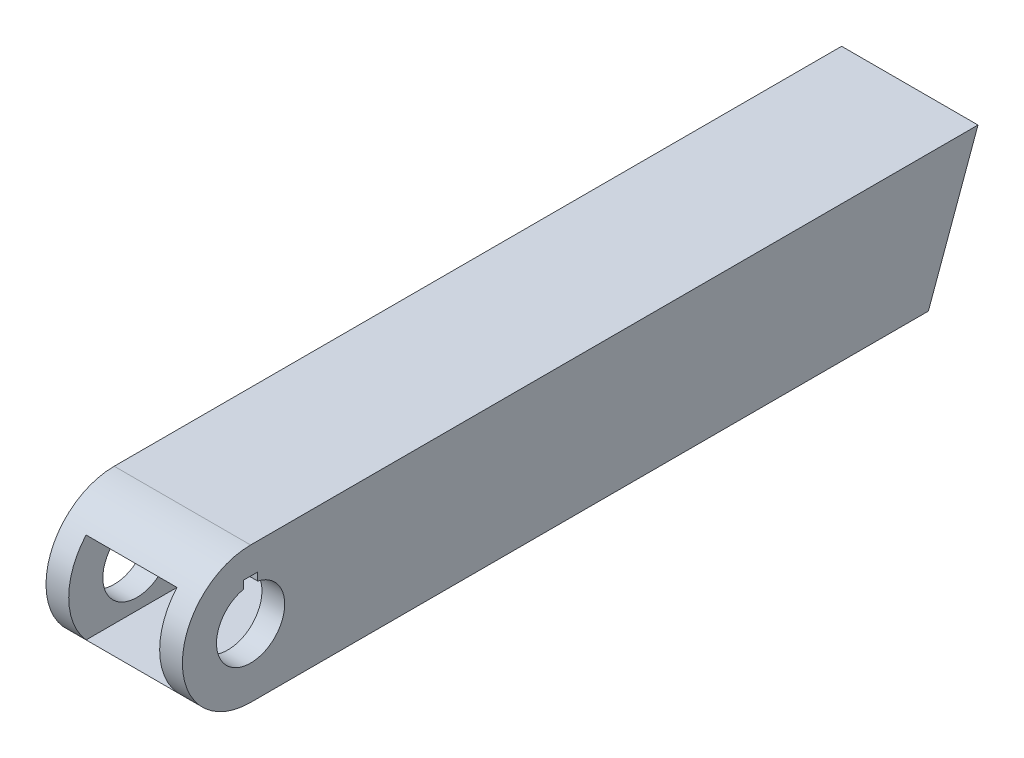
ISO-10303-21;
HEADER;
FILE_DESCRIPTION(('STEP AP214'),'2;1');
FILE_NAME('part.step','',(''),(''),'','','');
FILE_SCHEMA(('AUTOMOTIVE_DESIGN { 1 0 10303 214 1 1 1 1 }'));
ENDSEC;
DATA;
#1=APPLICATION_CONTEXT('core data for automotive mechanical design processes');
#2=APPLICATION_PROTOCOL_DEFINITION('international standard','automotive_design',2000,#1);
#3=PRODUCT_CONTEXT('',#1,'mechanical');
#4=PRODUCT('Part','Part','',(#3));
#5=PRODUCT_RELATED_PRODUCT_CATEGORY('part','',(#4));
#6=PRODUCT_DEFINITION_FORMATION('','',#4);
#7=PRODUCT_DEFINITION_CONTEXT('part definition',#1,'design');
#8=PRODUCT_DEFINITION('design','',#6,#7);
#9=PRODUCT_DEFINITION_SHAPE('','',#8);
#10=(LENGTH_UNIT() NAMED_UNIT(*) SI_UNIT(.MILLI.,.METRE.));
#11=(NAMED_UNIT(*) PLANE_ANGLE_UNIT() SI_UNIT($,.RADIAN.));
#12=(NAMED_UNIT(*) SI_UNIT($,.STERADIAN.) SOLID_ANGLE_UNIT());
#13=UNCERTAINTY_MEASURE_WITH_UNIT(LENGTH_MEASURE(1.E-05),#10,'distance_accuracy_value','');
#14=(GEOMETRIC_REPRESENTATION_CONTEXT(3) GLOBAL_UNCERTAINTY_ASSIGNED_CONTEXT((#13)) GLOBAL_UNIT_ASSIGNED_CONTEXT((#10,
#11,#12)) REPRESENTATION_CONTEXT('',''));
#15=CARTESIAN_POINT('',(0.,0.,0.));
#16=DIRECTION('',(0.,0.,1.));
#17=DIRECTION('',(1.,0.,0.));
#18=AXIS2_PLACEMENT_3D('',#15,#16,#17);
#19=CARTESIAN_POINT('',(19.05,0.,0.));
#20=DIRECTION('',(1.,0.,0.));
#21=DIRECTION('',(0.,0.,-1.));
#22=AXIS2_PLACEMENT_3D('',#19,#20,#21);
#23=PLANE('',#22);
#24=CARTESIAN_POINT('',(19.05,12.7,12.7));
#25=DIRECTION('',(1.,0.,0.));
#26=DIRECTION('',(0.,0.,-1.));
#27=AXIS2_PLACEMENT_3D('',#24,#25,#26);
#28=CIRCLE('',#27,4.7625);
#29=CARTESIAN_POINT('',(19.05,17.3563296973045,13.7));
#30=VERTEX_POINT('',#29);
#31=CARTESIAN_POINT('',(19.05,17.3563296973045,11.7));
#32=VERTEX_POINT('',#31);
#33=EDGE_CURVE('E295',#30,#32,#28,.T.);
#34=ORIENTED_EDGE('',*,*,#33,.F.);
#35=DIRECTION('',(0.,1.,0.));
#36=VECTOR('',#35,1.);
#37=CARTESIAN_POINT('',(19.05,0.,13.7));
#38=LINE('',#37,#36);
#39=CARTESIAN_POINT('',(19.05,18.4625,13.7));
#40=VERTEX_POINT('',#39);
#41=EDGE_CURVE('E237',#30,#40,#38,.T.);
#42=ORIENTED_EDGE('',*,*,#41,.T.);
#43=DIRECTION('',(0.,0.,1.));
#44=VECTOR('',#43,1.);
#45=CARTESIAN_POINT('',(19.05,18.4625,0.));
#46=LINE('',#45,#44);
#47=CARTESIAN_POINT('',(19.05,18.4625,11.7));
#48=VERTEX_POINT('',#47);
#49=EDGE_CURVE('E310',#48,#40,#46,.T.);
#50=ORIENTED_EDGE('',*,*,#49,.F.);
#51=DIRECTION('',(0.,1.,0.));
#52=VECTOR('',#51,1.);
#53=CARTESIAN_POINT('',(19.05,0.,11.7));
#54=LINE('',#53,#52);
#55=EDGE_CURVE('E308',#32,#48,#54,.T.);
#56=ORIENTED_EDGE('',*,*,#55,.F.);
#57=EDGE_LOOP('',(#34,#42,#50,#56));
#58=FACE_BOUND('',#57,.T.);
#59=CARTESIAN_POINT('',(19.05,12.7,12.7));
#60=DIRECTION('',(1.,0.,0.));
#61=DIRECTION('',(0.,0.,-1.));
#62=AXIS2_PLACEMENT_3D('',#59,#60,#61);
#63=CIRCLE('',#62,9.525);
#64=CARTESIAN_POINT('',(19.05,3.175,12.7));
#65=VERTEX_POINT('',#64);
#66=CARTESIAN_POINT('',(19.05,22.225,12.7));
#67=VERTEX_POINT('',#66);
#68=EDGE_CURVE('E176',#65,#67,#63,.F.);
#69=ORIENTED_EDGE('',*,*,#68,.F.);
#70=DIRECTION('',(0.,0.,-1.));
#71=VECTOR('',#70,1.);
#72=CARTESIAN_POINT('',(19.05,3.175,0.));
#73=LINE('',#72,#71);
#74=CARTESIAN_POINT('',(19.05,3.175,-81.9663670372294));
#75=VERTEX_POINT('',#74);
#76=EDGE_CURVE('E184',#65,#75,#73,.T.);
#77=ORIENTED_EDGE('',*,*,#76,.T.);
#78=DIRECTION('',(0.,-0.939692620785918,0.342020143325644));
#79=VECTOR('',#78,1.);
#80=CARTESIAN_POINT('',(19.05,-25.9720781247249,-71.3576981839989));
#81=LINE('',#80,#79);
#82=CARTESIAN_POINT('',(19.05,22.225,-88.9));
#83=VERTEX_POINT('',#82);
#84=EDGE_CURVE('E202',#83,#75,#81,.T.);
#85=ORIENTED_EDGE('',*,*,#84,.F.);
#86=DIRECTION('',(0.,0.,-1.));
#87=VECTOR('',#86,1.);
#88=CARTESIAN_POINT('',(19.05,22.225,0.));
#89=LINE('',#88,#87);
#90=EDGE_CURVE('E192',#67,#83,#89,.T.);
#91=ORIENTED_EDGE('',*,*,#90,.F.);
#92=EDGE_LOOP('',(#69,#77,#85,#91));
#93=FACE_BOUND('',#92,.T.);
#94=ADVANCED_FACE('F59',(#58,#93),#23,.T.);
#95=CARTESIAN_POINT('',(0.,0.,0.));
#96=DIRECTION('',(1.,0.,0.));
#97=DIRECTION('',(0.,0.,-1.));
#98=AXIS2_PLACEMENT_3D('',#95,#96,#97);
#99=PLANE('',#98);
#100=DIRECTION('',(0.,1.,0.));
#101=VECTOR('',#100,1.);
#102=CARTESIAN_POINT('',(0.,0.,13.7));
#103=LINE('',#102,#101);
#104=CARTESIAN_POINT('',(0.,17.3563296973045,13.7));
#105=VERTEX_POINT('',#104);
#106=CARTESIAN_POINT('',(0.,18.4625,13.7));
#107=VERTEX_POINT('',#106);
#108=EDGE_CURVE('E305',#105,#107,#103,.T.);
#109=ORIENTED_EDGE('',*,*,#108,.F.);
#110=CARTESIAN_POINT('',(0.,12.7,12.7));
#111=DIRECTION('',(1.,0.,0.));
#112=DIRECTION('',(0.,0.,-1.));
#113=AXIS2_PLACEMENT_3D('',#110,#111,#112);
#114=CIRCLE('',#113,4.7625);
#115=CARTESIAN_POINT('',(0.,17.3563296973045,11.7));
#116=VERTEX_POINT('',#115);
#117=EDGE_CURVE('E296',#105,#116,#114,.T.);
#118=ORIENTED_EDGE('',*,*,#117,.T.);
#119=DIRECTION('',(0.,1.,0.));
#120=VECTOR('',#119,1.);
#121=CARTESIAN_POINT('',(0.,0.,11.7));
#122=LINE('',#121,#120);
#123=CARTESIAN_POINT('',(0.,18.4625,11.7));
#124=VERTEX_POINT('',#123);
#125=EDGE_CURVE('E299',#116,#124,#122,.T.);
#126=ORIENTED_EDGE('',*,*,#125,.T.);
#127=DIRECTION('',(0.,0.,1.));
#128=VECTOR('',#127,1.);
#129=CARTESIAN_POINT('',(0.,18.4625,0.));
#130=LINE('',#129,#128);
#131=EDGE_CURVE('E302',#124,#107,#130,.T.);
#132=ORIENTED_EDGE('',*,*,#131,.T.);
#133=EDGE_LOOP('',(#109,#118,#126,#132));
#134=FACE_BOUND('',#133,.T.);
#135=DIRECTION('',(0.,0.,-1.));
#136=VECTOR('',#135,1.);
#137=CARTESIAN_POINT('',(0.,3.175,0.));
#138=LINE('',#137,#136);
#139=CARTESIAN_POINT('',(0.,3.175,12.7));
#140=VERTEX_POINT('',#139);
#141=CARTESIAN_POINT('',(0.,3.175,-81.9663670372294));
#142=VERTEX_POINT('',#141);
#143=EDGE_CURVE('E182',#140,#142,#138,.T.);
#144=ORIENTED_EDGE('',*,*,#143,.F.);
#145=CARTESIAN_POINT('',(0.,12.7,12.7));
#146=DIRECTION('',(1.,0.,0.));
#147=DIRECTION('',(0.,0.,-1.));
#148=AXIS2_PLACEMENT_3D('',#145,#146,#147);
#149=CIRCLE('',#148,9.525);
#150=CARTESIAN_POINT('',(0.,22.225,12.7));
#151=VERTEX_POINT('',#150);
#152=EDGE_CURVE('E168',#140,#151,#149,.F.);
#153=ORIENTED_EDGE('',*,*,#152,.T.);
#154=DIRECTION('',(0.,0.,-1.));
#155=VECTOR('',#154,1.);
#156=CARTESIAN_POINT('',(0.,22.225,0.));
#157=LINE('',#156,#155);
#158=CARTESIAN_POINT('',(0.,22.225,-88.9));
#159=VERTEX_POINT('',#158);
#160=EDGE_CURVE('E190',#151,#159,#157,.T.);
#161=ORIENTED_EDGE('',*,*,#160,.T.);
#162=DIRECTION('',(0.,-0.939692620785918,0.342020143325644));
#163=VECTOR('',#162,1.);
#164=CARTESIAN_POINT('',(0.,-25.9720781247249,-71.3576981839989));
#165=LINE('',#164,#163);
#166=EDGE_CURVE('E189',#159,#142,#165,.T.);
#167=ORIENTED_EDGE('',*,*,#166,.T.);
#168=EDGE_LOOP('',(#144,#153,#161,#167));
#169=FACE_BOUND('',#168,.T.);
#170=ADVANCED_FACE('F187',(#134,#169),#99,.F.);
#171=CARTESIAN_POINT('',(3.175,6.35,-88.9));
#172=DIRECTION('',(-1.,0.,0.));
#173=DIRECTION('',(0.,0.,1.));
#174=AXIS2_PLACEMENT_3D('',#171,#172,#173);
#175=PLANE('',#174);
#176=DIRECTION('',(0.,-1.,0.));
#177=VECTOR('',#176,1.);
#178=CARTESIAN_POINT('',(3.175,6.35,11.7));
#179=LINE('',#178,#177);
#180=CARTESIAN_POINT('',(3.175,18.4625,11.7));
#181=VERTEX_POINT('',#180);
#182=CARTESIAN_POINT('',(3.175,17.3563296973045,11.7));
#183=VERTEX_POINT('',#182);
#184=EDGE_CURVE('E243',#181,#183,#179,.T.);
#185=ORIENTED_EDGE('',*,*,#184,.T.);
#186=CARTESIAN_POINT('',(3.175,12.7,12.7));
#187=DIRECTION('',(-1.,0.,0.));
#188=DIRECTION('',(0.,0.,1.));
#189=AXIS2_PLACEMENT_3D('',#186,#187,#188);
#190=CIRCLE('',#189,4.7625);
#191=CARTESIAN_POINT('',(3.175,17.3563296973045,13.7));
#192=VERTEX_POINT('',#191);
#193=EDGE_CURVE('E263',#183,#192,#190,.T.);
#194=ORIENTED_EDGE('',*,*,#193,.T.);
#195=DIRECTION('',(0.,-1.,0.));
#196=VECTOR('',#195,1.);
#197=CARTESIAN_POINT('',(3.175,6.35,13.7));
#198=LINE('',#197,#196);
#199=CARTESIAN_POINT('',(3.175,18.4625,13.7));
#200=VERTEX_POINT('',#199);
#201=EDGE_CURVE('E261',#200,#192,#198,.T.);
#202=ORIENTED_EDGE('',*,*,#201,.F.);
#203=DIRECTION('',(0.,0.,-1.));
#204=VECTOR('',#203,1.);
#205=CARTESIAN_POINT('',(3.175,18.4625,-88.9));
#206=LINE('',#205,#204);
#207=EDGE_CURVE('E258',#200,#181,#206,.T.);
#208=ORIENTED_EDGE('',*,*,#207,.T.);
#209=EDGE_LOOP('',(#185,#194,#202,#208));
#210=FACE_BOUND('',#209,.T.);
#211=DIRECTION('',(0.,0.,1.));
#212=VECTOR('',#211,1.);
#213=CARTESIAN_POINT('',(3.175,19.05,-88.9));
#214=LINE('',#213,#212);
#215=CARTESIAN_POINT('',(3.175,19.05,-87.7443945062049));
#216=VERTEX_POINT('',#215);
#217=CARTESIAN_POINT('',(3.175,19.05,19.7995158285618));
#218=VERTEX_POINT('',#217);
#219=EDGE_CURVE('E194',#216,#218,#214,.T.);
#220=ORIENTED_EDGE('',*,*,#219,.T.);
#221=CARTESIAN_POINT('',(3.175,12.7,12.7));
#222=DIRECTION('',(-1.,0.,0.));
#223=DIRECTION('',(0.,0.,1.));
#224=AXIS2_PLACEMENT_3D('',#221,#222,#223);
#225=CIRCLE('',#224,9.525);
#226=CARTESIAN_POINT('',(3.175,6.35,19.7995158285618));
#227=VERTEX_POINT('',#226);
#228=EDGE_CURVE('E292',#218,#227,#225,.F.);
#229=ORIENTED_EDGE('',*,*,#228,.T.);
#230=DIRECTION('',(0.,0.,1.));
#231=VECTOR('',#230,1.);
#232=CARTESIAN_POINT('',(3.175,6.35,-88.9));
#233=LINE('',#232,#231);
#234=CARTESIAN_POINT('',(3.175,6.35,-83.1219725310245));
#235=VERTEX_POINT('',#234);
#236=EDGE_CURVE('E266',#235,#227,#233,.T.);
#237=ORIENTED_EDGE('',*,*,#236,.F.);
#238=DIRECTION('',(0.,0.939692620785918,-0.342020143325644));
#239=VECTOR('',#238,1.);
#240=CARTESIAN_POINT('',(3.175,-25.9720781247249,-71.3576981839989));
#241=LINE('',#240,#239);
#242=EDGE_CURVE('E211',#235,#216,#241,.T.);
#243=ORIENTED_EDGE('',*,*,#242,.T.);
#244=EDGE_LOOP('',(#220,#229,#237,#243));
#245=FACE_BOUND('',#244,.T.);
#246=ADVANCED_FACE('F340',(#210,#245),#175,.F.);
#247=CARTESIAN_POINT('',(15.875,6.35,-88.9));
#248=DIRECTION('',(1.,0.,0.));
#249=DIRECTION('',(0.,0.,-1.));
#250=AXIS2_PLACEMENT_3D('',#247,#248,#249);
#251=PLANE('',#250);
#252=DIRECTION('',(0.,1.,0.));
#253=VECTOR('',#252,1.);
#254=CARTESIAN_POINT('',(15.875,6.35,13.7));
#255=LINE('',#254,#253);
#256=CARTESIAN_POINT('',(15.875,17.3563296973045,13.7));
#257=VERTEX_POINT('',#256);
#258=CARTESIAN_POINT('',(15.875,18.4625,13.7));
#259=VERTEX_POINT('',#258);
#260=EDGE_CURVE('E219',#257,#259,#255,.T.);
#261=ORIENTED_EDGE('',*,*,#260,.F.);
#262=CARTESIAN_POINT('',(15.875,12.7,12.7));
#263=DIRECTION('',(1.,0.,0.));
#264=DIRECTION('',(0.,0.,-1.));
#265=AXIS2_PLACEMENT_3D('',#262,#263,#264);
#266=CIRCLE('',#265,4.7625);
#267=CARTESIAN_POINT('',(15.875,17.3563296973045,11.7));
#268=VERTEX_POINT('',#267);
#269=EDGE_CURVE('E67',#257,#268,#266,.T.);
#270=ORIENTED_EDGE('',*,*,#269,.T.);
#271=DIRECTION('',(0.,1.,0.));
#272=VECTOR('',#271,1.);
#273=CARTESIAN_POINT('',(15.875,6.35,11.7));
#274=LINE('',#273,#272);
#275=CARTESIAN_POINT('',(15.875,18.4625,11.7));
#276=VERTEX_POINT('',#275);
#277=EDGE_CURVE('E213',#268,#276,#274,.T.);
#278=ORIENTED_EDGE('',*,*,#277,.T.);
#279=DIRECTION('',(0.,0.,1.));
#280=VECTOR('',#279,1.);
#281=CARTESIAN_POINT('',(15.875,18.4625,-88.9));
#282=LINE('',#281,#280);
#283=EDGE_CURVE('E216',#276,#259,#282,.T.);
#284=ORIENTED_EDGE('',*,*,#283,.T.);
#285=EDGE_LOOP('',(#261,#270,#278,#284));
#286=FACE_BOUND('',#285,.T.);
#287=DIRECTION('',(0.,0.,1.));
#288=VECTOR('',#287,1.);
#289=CARTESIAN_POINT('',(15.875,6.35,-88.9));
#290=LINE('',#289,#288);
#291=CARTESIAN_POINT('',(15.875,6.34999999999999,-83.1219725310245));
#292=VERTEX_POINT('',#291);
#293=CARTESIAN_POINT('',(15.875,6.35,19.7995158285618));
#294=VERTEX_POINT('',#293);
#295=EDGE_CURVE('E272',#292,#294,#290,.T.);
#296=ORIENTED_EDGE('',*,*,#295,.T.);
#297=CARTESIAN_POINT('',(15.875,12.7,12.7));
#298=DIRECTION('',(1.,0.,0.));
#299=DIRECTION('',(0.,0.,-1.));
#300=AXIS2_PLACEMENT_3D('',#297,#298,#299);
#301=CIRCLE('',#300,9.525);
#302=CARTESIAN_POINT('',(15.875,19.05,19.7995158285618));
#303=VERTEX_POINT('',#302);
#304=EDGE_CURVE('E82',#294,#303,#301,.F.);
#305=ORIENTED_EDGE('',*,*,#304,.T.);
#306=DIRECTION('',(0.,0.,1.));
#307=VECTOR('',#306,1.);
#308=CARTESIAN_POINT('',(15.875,19.05,-88.9));
#309=LINE('',#308,#307);
#310=CARTESIAN_POINT('',(15.875,19.05,-87.7443945062049));
#311=VERTEX_POINT('',#310);
#312=EDGE_CURVE('E269',#311,#303,#309,.T.);
#313=ORIENTED_EDGE('',*,*,#312,.F.);
#314=DIRECTION('',(0.,-0.939692620785918,0.342020143325644));
#315=VECTOR('',#314,1.);
#316=CARTESIAN_POINT('',(15.875,-25.9720781247249,-71.3576981839989));
#317=LINE('',#316,#315);
#318=EDGE_CURVE('E206',#311,#292,#317,.T.);
#319=ORIENTED_EDGE('',*,*,#318,.T.);
#320=EDGE_LOOP('',(#296,#305,#313,#319));
#321=FACE_BOUND('',#320,.T.);
#322=ADVANCED_FACE('F223',(#286,#321),#251,.F.);
#323=CARTESIAN_POINT('',(19.05,22.225,0.));
#324=DIRECTION('',(0.,1.,0.));
#325=DIRECTION('',(0.,0.,1.));
#326=AXIS2_PLACEMENT_3D('',#323,#324,#325);
#327=PLANE('',#326);
#328=DIRECTION('',(1.,0.,0.));
#329=VECTOR('',#328,1.);
#330=CARTESIAN_POINT('',(0.,22.225,12.7));
#331=LINE('',#330,#329);
#332=EDGE_CURVE('E74',#151,#67,#331,.T.);
#333=ORIENTED_EDGE('',*,*,#332,.T.);
#334=ORIENTED_EDGE('',*,*,#90,.T.);
#335=DIRECTION('',(-1.,0.,0.));
#336=VECTOR('',#335,1.);
#337=CARTESIAN_POINT('',(19.05,22.225,-88.9));
#338=LINE('',#337,#336);
#339=EDGE_CURVE('E198',#83,#159,#338,.T.);
#340=ORIENTED_EDGE('',*,*,#339,.T.);
#341=ORIENTED_EDGE('',*,*,#160,.F.);
#342=EDGE_LOOP('',(#333,#334,#340,#341));
#343=FACE_BOUND('',#342,.T.);
#344=ADVANCED_FACE('F61',(#343),#327,.T.);
#345=CARTESIAN_POINT('',(19.05,3.175,0.));
#346=DIRECTION('',(0.,1.,0.));
#347=DIRECTION('',(0.,0.,1.));
#348=AXIS2_PLACEMENT_3D('',#345,#346,#347);
#349=PLANE('',#348);
#350=ORIENTED_EDGE('',*,*,#76,.F.);
#351=DIRECTION('',(1.,0.,0.));
#352=VECTOR('',#351,1.);
#353=CARTESIAN_POINT('',(0.,3.175,12.7));
#354=LINE('',#353,#352);
#355=EDGE_CURVE('E171',#140,#65,#354,.T.);
#356=ORIENTED_EDGE('',*,*,#355,.F.);
#357=ORIENTED_EDGE('',*,*,#143,.T.);
#358=DIRECTION('',(-1.,0.,0.));
#359=VECTOR('',#358,1.);
#360=CARTESIAN_POINT('',(19.05,3.175,-81.9663670372294));
#361=LINE('',#360,#359);
#362=EDGE_CURVE('E201',#75,#142,#361,.T.);
#363=ORIENTED_EDGE('',*,*,#362,.F.);
#364=EDGE_LOOP('',(#350,#356,#357,#363));
#365=FACE_BOUND('',#364,.T.);
#366=ADVANCED_FACE('F180',(#365),#349,.F.);
#367=CARTESIAN_POINT('',(19.05,-25.9720781247249,-71.3576981839989));
#368=DIRECTION('',(0.,-0.342020143325644,-0.939692620785917));
#369=DIRECTION('',(0.,0.939692620785918,-0.342020143325644));
#370=AXIS2_PLACEMENT_3D('',#367,#368,#369);
#371=PLANE('',#370);
#372=ORIENTED_EDGE('',*,*,#242,.F.);
#373=DIRECTION('',(-1.,0.,0.));
#374=VECTOR('',#373,1.);
#375=CARTESIAN_POINT('',(19.05,6.34999999999999,-83.1219725310245));
#376=LINE('',#375,#374);
#377=EDGE_CURVE('E204',#292,#235,#376,.T.);
#378=ORIENTED_EDGE('',*,*,#377,.F.);
#379=ORIENTED_EDGE('',*,*,#318,.F.);
#380=DIRECTION('',(1.,0.,0.));
#381=VECTOR('',#380,1.);
#382=CARTESIAN_POINT('',(19.05,19.05,-87.7443945062049));
#383=LINE('',#382,#381);
#384=EDGE_CURVE('E209',#216,#311,#383,.T.);
#385=ORIENTED_EDGE('',*,*,#384,.F.);
#386=EDGE_LOOP('',(#372,#378,#379,#385));
#387=FACE_BOUND('',#386,.T.);
#388=ORIENTED_EDGE('',*,*,#166,.F.);
#389=ORIENTED_EDGE('',*,*,#339,.F.);
#390=ORIENTED_EDGE('',*,*,#84,.T.);
#391=ORIENTED_EDGE('',*,*,#362,.T.);
#392=EDGE_LOOP('',(#388,#389,#390,#391));
#393=FACE_BOUND('',#392,.T.);
#394=ADVANCED_FACE('F282',(#387,#393),#371,.T.);
#395=CARTESIAN_POINT('',(15.875,19.05,-88.9));
#396=DIRECTION('',(0.,1.,0.));
#397=DIRECTION('',(0.,0.,1.));
#398=AXIS2_PLACEMENT_3D('',#395,#396,#397);
#399=PLANE('',#398);
#400=ORIENTED_EDGE('',*,*,#312,.T.);
#401=DIRECTION('',(1.,0.,0.));
#402=VECTOR('',#401,1.);
#403=CARTESIAN_POINT('',(0.,19.05,19.7995158285618));
#404=LINE('',#403,#402);
#405=EDGE_CURVE('E289',#303,#218,#404,.F.);
#406=ORIENTED_EDGE('',*,*,#405,.T.);
#407=ORIENTED_EDGE('',*,*,#219,.F.);
#408=ORIENTED_EDGE('',*,*,#384,.T.);
#409=EDGE_LOOP('',(#400,#406,#407,#408));
#410=FACE_BOUND('',#409,.T.);
#411=ADVANCED_FACE('F346',(#410),#399,.F.);
#412=CARTESIAN_POINT('',(15.875,6.35,-88.9));
#413=DIRECTION('',(0.,-1.,0.));
#414=DIRECTION('',(1.,0.,0.));
#415=AXIS2_PLACEMENT_3D('',#412,#413,#414);
#416=PLANE('',#415);
#417=ORIENTED_EDGE('',*,*,#236,.T.);
#418=DIRECTION('',(1.,0.,0.));
#419=VECTOR('',#418,1.);
#420=CARTESIAN_POINT('',(0.,6.35,19.7995158285618));
#421=LINE('',#420,#419);
#422=EDGE_CURVE('E12',#227,#294,#421,.T.);
#423=ORIENTED_EDGE('',*,*,#422,.T.);
#424=ORIENTED_EDGE('',*,*,#295,.F.);
#425=ORIENTED_EDGE('',*,*,#377,.T.);
#426=EDGE_LOOP('',(#417,#423,#424,#425));
#427=FACE_BOUND('',#426,.T.);
#428=ADVANCED_FACE('F329',(#427),#416,.F.);
#429=CARTESIAN_POINT('',(0.,0.,11.7));
#430=DIRECTION('',(0.,0.,-1.));
#431=DIRECTION('',(-1.,0.,0.));
#432=AXIS2_PLACEMENT_3D('',#429,#430,#431);
#433=PLANE('',#432);
#434=DIRECTION('',(1.,0.,0.));
#435=VECTOR('',#434,1.);
#436=CARTESIAN_POINT('',(0.,17.3563296973045,11.7));
#437=LINE('',#436,#435);
#438=EDGE_CURVE('E232',#268,#32,#437,.T.);
#439=ORIENTED_EDGE('',*,*,#438,.T.);
#440=ORIENTED_EDGE('',*,*,#55,.T.);
#441=DIRECTION('',(1.,0.,0.));
#442=VECTOR('',#441,1.);
#443=CARTESIAN_POINT('',(0.,18.4625,11.7));
#444=LINE('',#443,#442);
#445=EDGE_CURVE('E253',#276,#48,#444,.T.);
#446=ORIENTED_EDGE('',*,*,#445,.F.);
#447=ORIENTED_EDGE('',*,*,#277,.F.);
#448=EDGE_LOOP('',(#439,#440,#446,#447));
#449=FACE_BOUND('',#448,.T.);
#450=ADVANCED_FACE('F317',(#449),#433,.F.);
#451=CARTESIAN_POINT('',(0.,18.4625,0.));
#452=DIRECTION('',(0.,1.,0.));
#453=DIRECTION('',(0.,0.,1.));
#454=AXIS2_PLACEMENT_3D('',#451,#452,#453);
#455=PLANE('',#454);
#456=ORIENTED_EDGE('',*,*,#445,.T.);
#457=ORIENTED_EDGE('',*,*,#49,.T.);
#458=DIRECTION('',(1.,0.,0.));
#459=VECTOR('',#458,1.);
#460=CARTESIAN_POINT('',(0.,18.4625,13.7));
#461=LINE('',#460,#459);
#462=EDGE_CURVE('E245',#259,#40,#461,.T.);
#463=ORIENTED_EDGE('',*,*,#462,.F.);
#464=ORIENTED_EDGE('',*,*,#283,.F.);
#465=EDGE_LOOP('',(#456,#457,#463,#464));
#466=FACE_BOUND('',#465,.T.);
#467=ADVANCED_FACE('F319',(#466),#455,.F.);
#468=CARTESIAN_POINT('',(0.,0.,13.7));
#469=DIRECTION('',(0.,0.,-1.));
#470=DIRECTION('',(-1.,0.,0.));
#471=AXIS2_PLACEMENT_3D('',#468,#469,#470);
#472=PLANE('',#471);
#473=ORIENTED_EDGE('',*,*,#260,.T.);
#474=ORIENTED_EDGE('',*,*,#462,.T.);
#475=ORIENTED_EDGE('',*,*,#41,.F.);
#476=DIRECTION('',(1.,0.,0.));
#477=VECTOR('',#476,1.);
#478=CARTESIAN_POINT('',(0.,17.3563296973045,13.7));
#479=LINE('',#478,#477);
#480=EDGE_CURVE('E229',#257,#30,#479,.T.);
#481=ORIENTED_EDGE('',*,*,#480,.F.);
#482=EDGE_LOOP('',(#473,#474,#475,#481));
#483=FACE_BOUND('',#482,.T.);
#484=ADVANCED_FACE('F234',(#483),#472,.T.);
#485=CARTESIAN_POINT('',(0.,12.7,12.7));
#486=DIRECTION('',(1.,0.,0.));
#487=DIRECTION('',(0.,0.,-1.));
#488=AXIS2_PLACEMENT_3D('',#485,#486,#487);
#489=CYLINDRICAL_SURFACE('',#488,4.7625);
#490=ORIENTED_EDGE('',*,*,#480,.T.);
#491=ORIENTED_EDGE('',*,*,#33,.T.);
#492=ORIENTED_EDGE('',*,*,#438,.F.);
#493=ORIENTED_EDGE('',*,*,#269,.F.);
#494=EDGE_LOOP('',(#490,#491,#492,#493));
#495=FACE_BOUND('',#494,.T.);
#496=ADVANCED_FACE('F228',(#495),#489,.F.);
#497=EDGE_CURVE('E254',#116,#183,#437,.T.);
#498=ORIENTED_EDGE('',*,*,#497,.F.);
#499=ORIENTED_EDGE('',*,*,#117,.F.);
#500=EDGE_CURVE('E239',#105,#192,#479,.T.);
#501=ORIENTED_EDGE('',*,*,#500,.T.);
#502=ORIENTED_EDGE('',*,*,#193,.F.);
#503=EDGE_LOOP('',(#498,#499,#501,#502));
#504=FACE_BOUND('',#503,.T.);
#505=ADVANCED_FACE('F384',(#504),#489,.F.);
#506=ORIENTED_EDGE('',*,*,#201,.T.);
#507=ORIENTED_EDGE('',*,*,#500,.F.);
#508=ORIENTED_EDGE('',*,*,#108,.T.);
#509=EDGE_CURVE('E240',#107,#200,#461,.T.);
#510=ORIENTED_EDGE('',*,*,#509,.T.);
#511=EDGE_LOOP('',(#506,#507,#508,#510));
#512=FACE_BOUND('',#511,.T.);
#513=ADVANCED_FACE('F328',(#512),#472,.T.);
#514=ORIENTED_EDGE('',*,*,#509,.F.);
#515=ORIENTED_EDGE('',*,*,#131,.F.);
#516=EDGE_CURVE('E250',#124,#181,#444,.T.);
#517=ORIENTED_EDGE('',*,*,#516,.T.);
#518=ORIENTED_EDGE('',*,*,#207,.F.);
#519=EDGE_LOOP('',(#514,#515,#517,#518));
#520=FACE_BOUND('',#519,.T.);
#521=ADVANCED_FACE('F322',(#520),#455,.F.);
#522=ORIENTED_EDGE('',*,*,#516,.F.);
#523=ORIENTED_EDGE('',*,*,#125,.F.);
#524=ORIENTED_EDGE('',*,*,#497,.T.);
#525=ORIENTED_EDGE('',*,*,#184,.F.);
#526=EDGE_LOOP('',(#522,#523,#524,#525));
#527=FACE_BOUND('',#526,.T.);
#528=ADVANCED_FACE('F331',(#527),#433,.F.);
#529=CARTESIAN_POINT('',(0.,12.7,12.7));
#530=DIRECTION('',(1.,0.,0.));
#531=DIRECTION('',(0.,0.,-1.));
#532=AXIS2_PLACEMENT_3D('',#529,#530,#531);
#533=CYLINDRICAL_SURFACE('',#532,9.525);
#534=ORIENTED_EDGE('',*,*,#68,.T.);
#535=ORIENTED_EDGE('',*,*,#332,.F.);
#536=ORIENTED_EDGE('',*,*,#152,.F.);
#537=ORIENTED_EDGE('',*,*,#355,.T.);
#538=EDGE_LOOP('',(#534,#535,#536,#537));
#539=FACE_BOUND('',#538,.T.);
#540=ORIENTED_EDGE('',*,*,#405,.F.);
#541=ORIENTED_EDGE('',*,*,#304,.F.);
#542=ORIENTED_EDGE('',*,*,#422,.F.);
#543=ORIENTED_EDGE('',*,*,#228,.F.);
#544=EDGE_LOOP('',(#540,#541,#542,#543));
#545=FACE_BOUND('',#544,.T.);
#546=ADVANCED_FACE('F170',(#539,#545),#533,.T.);
#547=CLOSED_SHELL('',(#94,#170,#246,#322,#344,#366,#394,#411,#428,#450,#467,#484,#496,#505,#513,
#521,#528,#546));
#548=MANIFOLD_SOLID_BREP('B2',#547);
#549=ADVANCED_BREP_SHAPE_REPRESENTATION('',(#18,#548),#14);
#550=SHAPE_DEFINITION_REPRESENTATION(#9,#549);
ENDSEC;
END-ISO-10303-21;
